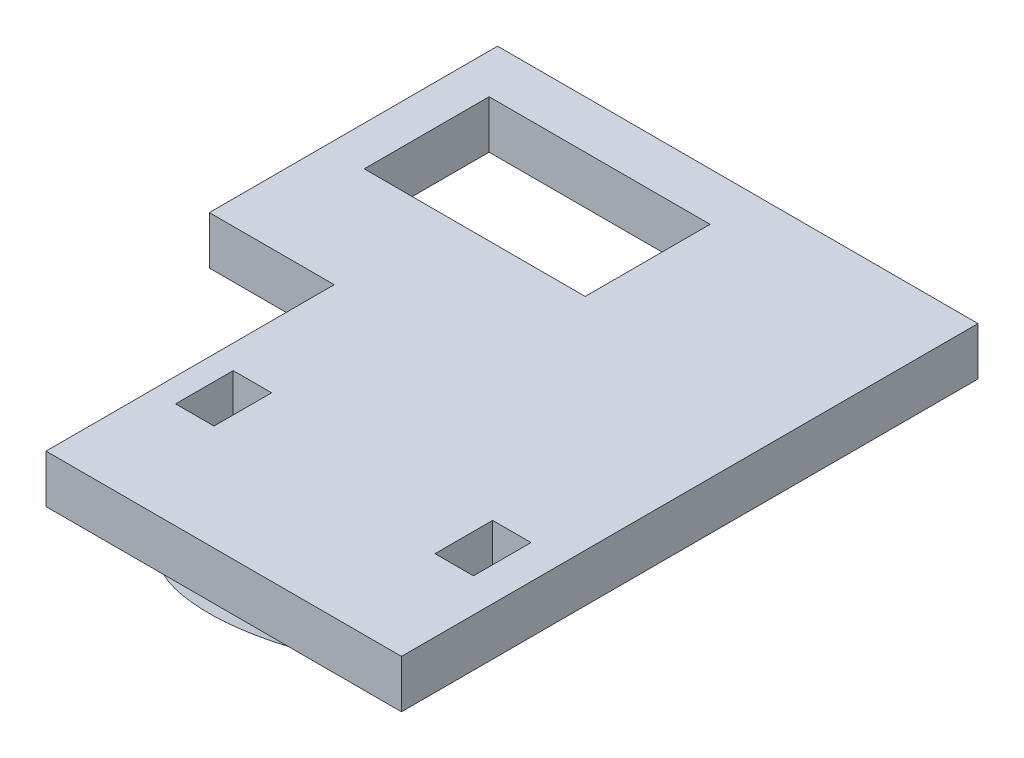
ISO-10303-21;
HEADER;
FILE_DESCRIPTION(('STEP AP214'),'2;1');
FILE_NAME('part.step','',(''),(''),'','','');
FILE_SCHEMA(('AUTOMOTIVE_DESIGN { 1 0 10303 214 1 1 1 1 }'));
ENDSEC;
DATA;
#1=APPLICATION_CONTEXT('core data for automotive mechanical design processes');
#2=APPLICATION_PROTOCOL_DEFINITION('international standard','automotive_design',2000,#1);
#3=PRODUCT_CONTEXT('',#1,'mechanical');
#4=PRODUCT('Part','Part','',(#3));
#5=PRODUCT_RELATED_PRODUCT_CATEGORY('part','',(#4));
#6=PRODUCT_DEFINITION_FORMATION('','',#4);
#7=PRODUCT_DEFINITION_CONTEXT('part definition',#1,'design');
#8=PRODUCT_DEFINITION('design','',#6,#7);
#9=PRODUCT_DEFINITION_SHAPE('','',#8);
#10=(LENGTH_UNIT() NAMED_UNIT(*) SI_UNIT(.MILLI.,.METRE.));
#11=(NAMED_UNIT(*) PLANE_ANGLE_UNIT() SI_UNIT($,.RADIAN.));
#12=(NAMED_UNIT(*) SI_UNIT($,.STERADIAN.) SOLID_ANGLE_UNIT());
#13=UNCERTAINTY_MEASURE_WITH_UNIT(LENGTH_MEASURE(1.E-05),#10,'distance_accuracy_value','');
#14=(GEOMETRIC_REPRESENTATION_CONTEXT(3) GLOBAL_UNCERTAINTY_ASSIGNED_CONTEXT((#13)) GLOBAL_UNIT_ASSIGNED_CONTEXT((#10,
#11,#12)) REPRESENTATION_CONTEXT('',''));
#15=CARTESIAN_POINT('',(0.,0.,0.));
#16=DIRECTION('',(0.,0.,1.));
#17=DIRECTION('',(1.,0.,0.));
#18=AXIS2_PLACEMENT_3D('',#15,#16,#17);
#19=CARTESIAN_POINT('',(0.,0.,0.));
#20=DIRECTION('',(0.,-1.,0.));
#21=DIRECTION('',(0.,0.,-1.));
#22=AXIS2_PLACEMENT_3D('',#19,#20,#21);
#23=PLANE('',#22);
#24=DIRECTION('',(0.,0.,-1.));
#25=VECTOR('',#24,1.);
#26=CARTESIAN_POINT('',(21.4848642681188,0.,13.));
#27=LINE('',#26,#25);
#28=CARTESIAN_POINT('',(21.4848642681188,0.,19.));
#29=VERTEX_POINT('',#28);
#30=CARTESIAN_POINT('',(21.4848642681188,0.,13.));
#31=VERTEX_POINT('',#30);
#32=EDGE_CURVE('E287',#29,#31,#27,.T.);
#33=ORIENTED_EDGE('',*,*,#32,.T.);
#34=DIRECTION('',(-1.,0.,0.));
#35=VECTOR('',#34,1.);
#36=CARTESIAN_POINT('',(17.4848642681188,0.,13.));
#37=LINE('',#36,#35);
#38=CARTESIAN_POINT('',(17.4848642681188,0.,13.));
#39=VERTEX_POINT('',#38);
#40=EDGE_CURVE('E310',#31,#39,#37,.T.);
#41=ORIENTED_EDGE('',*,*,#40,.T.);
#42=DIRECTION('',(0.,0.,1.));
#43=VECTOR('',#42,1.);
#44=CARTESIAN_POINT('',(17.4848642681188,0.,13.));
#45=LINE('',#44,#43);
#46=CARTESIAN_POINT('',(17.4848642681188,0.,19.));
#47=VERTEX_POINT('',#46);
#48=EDGE_CURVE('E279',#39,#47,#45,.T.);
#49=ORIENTED_EDGE('',*,*,#48,.T.);
#50=DIRECTION('',(1.,0.,0.));
#51=VECTOR('',#50,1.);
#52=CARTESIAN_POINT('',(17.4848642681188,0.,19.));
#53=LINE('',#52,#51);
#54=EDGE_CURVE('E283',#47,#29,#53,.T.);
#55=ORIENTED_EDGE('',*,*,#54,.T.);
#56=EDGE_LOOP('',(#33,#41,#49,#55));
#57=FACE_BOUND('',#56,.T.);
#58=DIRECTION('',(0.,0.,-1.));
#59=VECTOR('',#58,1.);
#60=CARTESIAN_POINT('',(2.1161584219283,0.,-25.));
#61=LINE('',#60,#59);
#62=CARTESIAN_POINT('',(2.1161584219283,0.,-12.));
#63=VERTEX_POINT('',#62);
#64=CARTESIAN_POINT('',(2.1161584219283,0.,-25.));
#65=VERTEX_POINT('',#64);
#66=EDGE_CURVE('E323',#63,#65,#61,.T.);
#67=ORIENTED_EDGE('',*,*,#66,.T.);
#68=DIRECTION('',(-1.,0.,0.));
#69=VECTOR('',#68,1.);
#70=CARTESIAN_POINT('',(-20.8838415780717,0.,-25.));
#71=LINE('',#70,#69);
#72=CARTESIAN_POINT('',(-20.8838415780717,0.,-25.));
#73=VERTEX_POINT('',#72);
#74=EDGE_CURVE('E327',#65,#73,#71,.T.);
#75=ORIENTED_EDGE('',*,*,#74,.T.);
#76=DIRECTION('',(0.,0.,1.));
#77=VECTOR('',#76,1.);
#78=CARTESIAN_POINT('',(-20.8838415780717,0.,-25.));
#79=LINE('',#78,#77);
#80=CARTESIAN_POINT('',(-20.8838415780717,0.,-12.));
#81=VERTEX_POINT('',#80);
#82=EDGE_CURVE('E332',#73,#81,#79,.T.);
#83=ORIENTED_EDGE('',*,*,#82,.T.);
#84=DIRECTION('',(1.,0.,0.));
#85=VECTOR('',#84,1.);
#86=CARTESIAN_POINT('',(-20.8838415780717,0.,-12.));
#87=LINE('',#86,#85);
#88=EDGE_CURVE('E336',#81,#63,#87,.T.);
#89=ORIENTED_EDGE('',*,*,#88,.T.);
#90=EDGE_LOOP('',(#67,#75,#83,#89));
#91=FACE_BOUND('',#90,.T.);
#92=DIRECTION('',(0.,0.,1.));
#93=VECTOR('',#92,1.);
#94=CARTESIAN_POINT('',(-12.,0.,0.));
#95=LINE('',#94,#93);
#96=CARTESIAN_POINT('',(-12.,0.,9.68487027661195));
#97=VERTEX_POINT('',#96);
#98=CARTESIAN_POINT('',(-12.,0.,30.));
#99=VERTEX_POINT('',#98);
#100=EDGE_CURVE('E244',#97,#99,#95,.T.);
#101=ORIENTED_EDGE('',*,*,#100,.F.);
#102=CARTESIAN_POINT('',(-11.9999999869951,0.,9.68487027661134));
#103=CARTESIAN_POINT('',(-11.9999879460501,0.,9.85246758281188));
#104=CARTESIAN_POINT('',(-11.9964211662955,0.,10.0200414324728));
#105=CARTESIAN_POINT('',(-11.9822535776862,0.,10.3548894634409));
#106=CARTESIAN_POINT('',(-11.9716528740302,0.,10.5221636491922));
#107=CARTESIAN_POINT('',(-11.9294205604047,0.,11.0230740749682));
#108=CARTESIAN_POINT('',(-11.8873586579816,0.,11.3558898182705));
#109=CARTESIAN_POINT('',(-11.7771767908481,0.,12.0081488487328));
#110=CARTESIAN_POINT('',(-11.7097704681746,0.,12.3277137397941));
#111=CARTESIAN_POINT('',(-11.5488235316981,0.,12.9601915911763));
#112=CARTESIAN_POINT('',(-11.455284178913,0.,13.2731048716789));
#113=CARTESIAN_POINT('',(-11.2451700137892,0.,13.8844946256083));
#114=CARTESIAN_POINT('',(-11.1290623702342,0.,14.1831320192302));
#115=CARTESIAN_POINT('',(-10.8734645594487,0.,14.7702331871478));
#116=CARTESIAN_POINT('',(-10.7339740676675,0.,15.0586968201658));
#117=CARTESIAN_POINT('',(-10.4281380051154,0.,15.6309371729727));
#118=CARTESIAN_POINT('',(-10.2611790926551,0.,15.9143874860475));
#119=CARTESIAN_POINT('',(-9.99383703685191,0.,16.3285694872892));
#120=CARTESIAN_POINT('',(-9.90188936380248,0.,16.4648192312281));
#121=CARTESIAN_POINT('',(-9.71250309071285,0.,16.733440375574));
#122=CARTESIAN_POINT('',(-9.61506468364963,0.,16.865811912036));
#123=CARTESIAN_POINT('',(-9.51494648048746,0.,16.9961509217686));
#124=B_SPLINE_CURVE_WITH_KNOTS('',3,(#102,#103,#104,#105,#106,#107,#108,#109,#110,#111,#112,
#113,#114,#115,#116,#117,#118,#119,#120,#121,#122,#123),.UNSPECIFIED.,.F.,.F.,(4,2,2,2,2,2,2,2,
2,2,4),(0.,0.502709515741837,1.00541151318033,2.01054146695505,2.989264193479,3.96793970106355,
4.92817772320738,5.8884290744299,6.87410929174356,7.36711021606487,7.86009382420233),.UNSPECIFIED.);
#125=CARTESIAN_POINT('',(-9.51504110383621,0.,16.9962236076011));
#126=VERTEX_POINT('',#125);
#127=EDGE_CURVE('E12',#97,#126,#124,.T.);
#128=ORIENTED_EDGE('',*,*,#127,.T.);
#129=DIRECTION('',(0.,0.,1.));
#130=VECTOR('',#129,1.);
#131=CARTESIAN_POINT('',(-9.5151357318812,0.,13.));
#132=LINE('',#131,#130);
#133=CARTESIAN_POINT('',(-9.5151357318812,0.,19.));
#134=VERTEX_POINT('',#133);
#135=EDGE_CURVE('E235',#126,#134,#132,.T.);
#136=ORIENTED_EDGE('',*,*,#135,.T.);
#137=DIRECTION('',(1.,0.,0.));
#138=VECTOR('',#137,1.);
#139=CARTESIAN_POINT('',(-9.5151357318812,0.,19.));
#140=LINE('',#139,#138);
#141=CARTESIAN_POINT('',(-7.56442455995392,0.,18.9999341993934));
#142=VERTEX_POINT('',#141);
#143=EDGE_CURVE('E228',#134,#142,#140,.T.);
#144=ORIENTED_EDGE('',*,*,#143,.T.);
#145=CARTESIAN_POINT('',(0.,0.,-2.31568428032765));
#146=CARTESIAN_POINT('',(0.5,0.,-2.31568428032765));
#147=CARTESIAN_POINT('',(1.03156081133997,0.,-2.28467167166605));
#148=CARTESIAN_POINT('',(2.15427989662464,0.,-2.13430750845828));
#149=CARTESIAN_POINT('',(2.7456,0.,-2.01488428032765));
#150=CARTESIAN_POINT('',(3.9744,0.,-1.65648428032765));
#151=CARTESIAN_POINT('',(4.61204393384674,0.,-1.41731286257737));
#152=CARTESIAN_POINT('',(5.90480999873753,0.,-0.787089405943102));
#153=CARTESIAN_POINT('',(6.56,0.,-0.395684280327651));
#154=CARTESIAN_POINT('',(7.84,0.,0.564315719672349));
#155=CARTESIAN_POINT('',(8.46462750985176,0.,1.13336807471082));
#156=CARTESIAN_POINT('',(9.61756427097016,0.,2.45444144682566));
#157=CARTESIAN_POINT('',(10.1453287197232,0.,3.20680706915332));
#158=CARTESIAN_POINT('',(11.0311418685121,0.,4.86770672313255));
#159=CARTESIAN_POINT('',(11.3884023668639,0.,5.77615003919898));
#160=CARTESIAN_POINT('',(11.8731360946746,0.,7.68478909245342));
#161=CARTESIAN_POINT('',(12.,0.,8.68431571967235));
#162=CARTESIAN_POINT('',(12.,0.,10.6843157196723));
#163=CARTESIAN_POINT('',(11.8731360946746,0.,11.6838423468913));
#164=CARTESIAN_POINT('',(11.3884023668639,0.,13.5924814001457));
#165=CARTESIAN_POINT('',(11.0311418685121,0.,14.5009247162121));
#166=CARTESIAN_POINT('',(10.1453287197232,0.,16.1618243701914));
#167=CARTESIAN_POINT('',(9.61756427097016,0.,16.914189992519));
#168=CARTESIAN_POINT('',(8.46462750985175,0.,18.2352633646339));
#169=CARTESIAN_POINT('',(7.84,0.,18.8043157196724));
#170=CARTESIAN_POINT('',(6.56,0.,19.7643157196724));
#171=CARTESIAN_POINT('',(5.90480999873753,0.,20.1557208452878));
#172=CARTESIAN_POINT('',(4.61204393384673,0.,20.7859443019221));
#173=CARTESIAN_POINT('',(3.9744,0.,21.0251157196724));
#174=CARTESIAN_POINT('',(2.7456,0.,21.3835157196724));
#175=CARTESIAN_POINT('',(2.15427989662464,0.,21.502938947803));
#176=CARTESIAN_POINT('',(1.03156081133996,0.,21.6533031110107));
#177=CARTESIAN_POINT('',(0.5,0.,21.6843157196724));
#178=CARTESIAN_POINT('',(-0.499999999999999,0.,21.6843157196723));
#179=CARTESIAN_POINT('',(-1.03156081133996,0.,21.6533031110107));
#180=CARTESIAN_POINT('',(-2.15427989662464,0.,21.502938947803));
#181=CARTESIAN_POINT('',(-2.7456,0.,21.3835157196724));
#182=CARTESIAN_POINT('',(-3.9744,0.,21.0251157196723));
#183=CARTESIAN_POINT('',(-4.61204393384673,0.,20.7859443019221));
#184=CARTESIAN_POINT('',(-5.90480999873753,0.,20.1557208452878));
#185=CARTESIAN_POINT('',(-6.56,0.,19.7643157196724));
#186=CARTESIAN_POINT('',(-7.84,0.,18.8043157196723));
#187=CARTESIAN_POINT('',(-8.46462750985175,0.,18.2352633646339));
#188=CARTESIAN_POINT('',(-9.61756427097016,0.,16.914189992519));
#189=CARTESIAN_POINT('',(-10.1453287197232,0.,16.1618243701914));
#190=CARTESIAN_POINT('',(-11.0311418685121,0.,14.5009247162121));
#191=CARTESIAN_POINT('',(-11.3884023668639,0.,13.5924814001457));
#192=CARTESIAN_POINT('',(-11.8731360946746,0.,11.6838423468913));
#193=CARTESIAN_POINT('',(-12.,0.,10.6843157196723));
#194=CARTESIAN_POINT('',(-12.,0.,8.68431571967235));
#195=CARTESIAN_POINT('',(-11.8731360946746,0.,7.68478909245341));
#196=CARTESIAN_POINT('',(-11.3884023668639,0.,5.77615003919898));
#197=CARTESIAN_POINT('',(-11.0311418685121,0.,4.86770672313256));
#198=CARTESIAN_POINT('',(-10.1453287197232,0.,3.20680706915332));
#199=CARTESIAN_POINT('',(-9.61756427097016,0.,2.45444144682566));
#200=CARTESIAN_POINT('',(-8.46462750985175,0.,1.13336807471082));
#201=CARTESIAN_POINT('',(-7.84,0.,0.56431571967235));
#202=CARTESIAN_POINT('',(-6.56,0.,-0.39568428032765));
#203=CARTESIAN_POINT('',(-5.90480999873753,0.,-0.787089405943102));
#204=CARTESIAN_POINT('',(-4.61204393384673,0.,-1.41731286257737));
#205=CARTESIAN_POINT('',(-3.9744,0.,-1.65648428032765));
#206=CARTESIAN_POINT('',(-2.7456,0.,-2.01488428032765));
#207=CARTESIAN_POINT('',(-2.15427989662464,0.,-2.13430750845828));
#208=CARTESIAN_POINT('',(-1.03156081133996,0.,-2.28467167166605));
#209=CARTESIAN_POINT('',(-0.5,0.,-2.31568428032765));
#210=CARTESIAN_POINT('',(0.,0.,-2.31568428032765));
#211=B_SPLINE_CURVE_WITH_KNOTS('',3,(#145,#146,#147,#148,#149,#150,#151,#152,#153,#154,#155,
#156,#157,#158,#159,#160,#161,#162,#163,#164,#165,#166,#167,#168,#169,#170,#171,#172,#173,#174,
#175,#176,#177,#178,#179,#180,#181,#182,#183,#184,#185,#186,#187,#188,#189,#190,#191,#192,#193,
#194,#195,#196,#197,#198,#199,#200,#201,#202,#203,#204,#205,#206,#207,#208,#209,#210),
.UNSPECIFIED.,.T.,.F.,(4,2,2,2,2,2,2,2,2,2,2,2,2,2,2,2,2,2,2,2,2,2,2,2,2,2,2,2,2,2,2,2,4),(0.,
0.03125,0.0625,0.09375,0.125,0.15625,0.1875,0.21875,0.25,0.28125,0.3125,0.34375,0.375,0.40625,
0.4375,0.46875,0.5,0.53125,0.5625,0.59375,0.625,0.65625,0.6875,0.71875,0.75,0.78125,0.8125,
0.84375,0.875,0.90625,0.9375,0.96875,1.),.UNSPECIFIED.);
#212=EDGE_CURVE('E71',#142,#97,#211,.F.);
#213=ORIENTED_EDGE('',*,*,#212,.T.);
#214=CARTESIAN_POINT('',(-12.,0.,0.));
#215=VERTEX_POINT('',#214);
#216=EDGE_CURVE('E403',#215,#97,#95,.T.);
#217=ORIENTED_EDGE('',*,*,#216,.F.);
#218=DIRECTION('',(1.,0.,0.));
#219=VECTOR('',#218,1.);
#220=CARTESIAN_POINT('',(-12.,0.,0.));
#221=LINE('',#220,#219);
#222=CARTESIAN_POINT('',(-25.,0.,0.));
#223=VERTEX_POINT('',#222);
#224=EDGE_CURVE('E397',#223,#215,#221,.T.);
#225=ORIENTED_EDGE('',*,*,#224,.F.);
#226=DIRECTION('',(0.,0.,1.));
#227=VECTOR('',#226,1.);
#228=CARTESIAN_POINT('',(-25.,0.,0.));
#229=LINE('',#228,#227);
#230=CARTESIAN_POINT('',(-25.,0.,-30.));
#231=VERTEX_POINT('',#230);
#232=EDGE_CURVE('E394',#231,#223,#229,.T.);
#233=ORIENTED_EDGE('',*,*,#232,.F.);
#234=DIRECTION('',(-1.,0.,0.));
#235=VECTOR('',#234,1.);
#236=CARTESIAN_POINT('',(-25.,0.,-30.));
#237=LINE('',#236,#235);
#238=CARTESIAN_POINT('',(25.,0.,-30.));
#239=VERTEX_POINT('',#238);
#240=EDGE_CURVE('E391',#239,#231,#237,.T.);
#241=ORIENTED_EDGE('',*,*,#240,.F.);
#242=DIRECTION('',(0.,0.,-1.));
#243=VECTOR('',#242,1.);
#244=CARTESIAN_POINT('',(25.,0.,30.));
#245=LINE('',#244,#243);
#246=CARTESIAN_POINT('',(25.,0.,30.));
#247=VERTEX_POINT('',#246);
#248=EDGE_CURVE('E357',#247,#239,#245,.T.);
#249=ORIENTED_EDGE('',*,*,#248,.F.);
#250=DIRECTION('',(1.,0.,0.));
#251=VECTOR('',#250,1.);
#252=CARTESIAN_POINT('',(0.,0.,30.));
#253=LINE('',#252,#251);
#254=EDGE_CURVE('E372',#99,#247,#253,.T.);
#255=ORIENTED_EDGE('',*,*,#254,.F.);
#256=EDGE_LOOP('',(#101,#128,#136,#144,#213,#217,#225,#233,#241,#249,#255));
#257=FACE_BOUND('',#256,.T.);
#258=ADVANCED_FACE('F55',(#57,#91,#257),#23,.T.);
#259=CARTESIAN_POINT('',(25.,5.,30.));
#260=DIRECTION('',(-1.,0.,0.));
#261=DIRECTION('',(0.,0.,1.));
#262=AXIS2_PLACEMENT_3D('',#259,#260,#261);
#263=PLANE('',#262);
#264=ORIENTED_EDGE('',*,*,#248,.T.);
#265=DIRECTION('',(0.,-1.,0.));
#266=VECTOR('',#265,1.);
#267=CARTESIAN_POINT('',(25.,5.,-30.));
#268=LINE('',#267,#266);
#269=CARTESIAN_POINT('',(25.,5.,-30.));
#270=VERTEX_POINT('',#269);
#271=EDGE_CURVE('E206',#270,#239,#268,.T.);
#272=ORIENTED_EDGE('',*,*,#271,.F.);
#273=DIRECTION('',(0.,0.,-1.));
#274=VECTOR('',#273,1.);
#275=CARTESIAN_POINT('',(25.,5.,30.));
#276=LINE('',#275,#274);
#277=CARTESIAN_POINT('',(25.,5.,30.));
#278=VERTEX_POINT('',#277);
#279=EDGE_CURVE('E367',#278,#270,#276,.T.);
#280=ORIENTED_EDGE('',*,*,#279,.F.);
#281=DIRECTION('',(0.,-1.,0.));
#282=VECTOR('',#281,1.);
#283=CARTESIAN_POINT('',(25.,5.,30.));
#284=LINE('',#283,#282);
#285=EDGE_CURVE('E387',#278,#247,#284,.T.);
#286=ORIENTED_EDGE('',*,*,#285,.T.);
#287=EDGE_LOOP('',(#264,#272,#280,#286));
#288=FACE_BOUND('',#287,.T.);
#289=ADVANCED_FACE('F57',(#288),#263,.F.);
#290=CARTESIAN_POINT('',(-25.,5.,-30.));
#291=DIRECTION('',(0.,0.,1.));
#292=DIRECTION('',(1.,0.,0.));
#293=AXIS2_PLACEMENT_3D('',#290,#291,#292);
#294=PLANE('',#293);
#295=ORIENTED_EDGE('',*,*,#240,.T.);
#296=DIRECTION('',(0.,-1.,0.));
#297=VECTOR('',#296,1.);
#298=CARTESIAN_POINT('',(-25.,5.,-30.));
#299=LINE('',#298,#297);
#300=CARTESIAN_POINT('',(-25.,5.,-30.));
#301=VERTEX_POINT('',#300);
#302=EDGE_CURVE('E448',#301,#231,#299,.T.);
#303=ORIENTED_EDGE('',*,*,#302,.F.);
#304=DIRECTION('',(-1.,0.,0.));
#305=VECTOR('',#304,1.);
#306=CARTESIAN_POINT('',(-25.,5.,-30.));
#307=LINE('',#306,#305);
#308=EDGE_CURVE('E371',#270,#301,#307,.T.);
#309=ORIENTED_EDGE('',*,*,#308,.F.);
#310=ORIENTED_EDGE('',*,*,#271,.T.);
#311=EDGE_LOOP('',(#295,#303,#309,#310));
#312=FACE_BOUND('',#311,.T.);
#313=ADVANCED_FACE('F437',(#312),#294,.F.);
#314=CARTESIAN_POINT('',(-25.,5.,0.));
#315=DIRECTION('',(1.,0.,0.));
#316=DIRECTION('',(0.,0.,-1.));
#317=AXIS2_PLACEMENT_3D('',#314,#315,#316);
#318=PLANE('',#317);
#319=ORIENTED_EDGE('',*,*,#232,.T.);
#320=DIRECTION('',(0.,-1.,0.));
#321=VECTOR('',#320,1.);
#322=CARTESIAN_POINT('',(-25.,5.,0.));
#323=LINE('',#322,#321);
#324=CARTESIAN_POINT('',(-25.,5.,0.));
#325=VERTEX_POINT('',#324);
#326=EDGE_CURVE('E456',#325,#223,#323,.T.);
#327=ORIENTED_EDGE('',*,*,#326,.F.);
#328=DIRECTION('',(0.,0.,1.));
#329=VECTOR('',#328,1.);
#330=CARTESIAN_POINT('',(-25.,5.,0.));
#331=LINE('',#330,#329);
#332=EDGE_CURVE('E375',#301,#325,#331,.T.);
#333=ORIENTED_EDGE('',*,*,#332,.F.);
#334=ORIENTED_EDGE('',*,*,#302,.T.);
#335=EDGE_LOOP('',(#319,#327,#333,#334));
#336=FACE_BOUND('',#335,.T.);
#337=ADVANCED_FACE('F434',(#336),#318,.F.);
#338=CARTESIAN_POINT('',(-12.,5.,0.));
#339=DIRECTION('',(0.,0.,-1.));
#340=DIRECTION('',(-1.,0.,0.));
#341=AXIS2_PLACEMENT_3D('',#338,#339,#340);
#342=PLANE('',#341);
#343=ORIENTED_EDGE('',*,*,#224,.T.);
#344=DIRECTION('',(0.,-1.,0.));
#345=VECTOR('',#344,1.);
#346=CARTESIAN_POINT('',(-12.,5.,0.));
#347=LINE('',#346,#345);
#348=CARTESIAN_POINT('',(-12.,5.,0.));
#349=VERTEX_POINT('',#348);
#350=EDGE_CURVE('E462',#349,#215,#347,.T.);
#351=ORIENTED_EDGE('',*,*,#350,.F.);
#352=DIRECTION('',(1.,0.,0.));
#353=VECTOR('',#352,1.);
#354=CARTESIAN_POINT('',(-12.,5.,0.));
#355=LINE('',#354,#353);
#356=EDGE_CURVE('E378',#325,#349,#355,.T.);
#357=ORIENTED_EDGE('',*,*,#356,.F.);
#358=ORIENTED_EDGE('',*,*,#326,.T.);
#359=EDGE_LOOP('',(#343,#351,#357,#358));
#360=FACE_BOUND('',#359,.T.);
#361=ADVANCED_FACE('F430',(#360),#342,.F.);
#362=CARTESIAN_POINT('',(-12.,5.,0.));
#363=DIRECTION('',(1.,0.,0.));
#364=DIRECTION('',(0.,0.,-1.));
#365=AXIS2_PLACEMENT_3D('',#362,#363,#364);
#366=PLANE('',#365);
#367=ORIENTED_EDGE('',*,*,#216,.T.);
#368=ORIENTED_EDGE('',*,*,#100,.T.);
#369=DIRECTION('',(0.,-1.,0.));
#370=VECTOR('',#369,1.);
#371=CARTESIAN_POINT('',(-12.,5.,30.));
#372=LINE('',#371,#370);
#373=CARTESIAN_POINT('',(-12.,5.,30.));
#374=VERTEX_POINT('',#373);
#375=EDGE_CURVE('E466',#374,#99,#372,.T.);
#376=ORIENTED_EDGE('',*,*,#375,.F.);
#377=DIRECTION('',(0.,0.,1.));
#378=VECTOR('',#377,1.);
#379=CARTESIAN_POINT('',(-12.,5.,0.));
#380=LINE('',#379,#378);
#381=EDGE_CURVE('E381',#349,#374,#380,.T.);
#382=ORIENTED_EDGE('',*,*,#381,.F.);
#383=ORIENTED_EDGE('',*,*,#350,.T.);
#384=EDGE_LOOP('',(#367,#368,#376,#382,#383));
#385=FACE_BOUND('',#384,.T.);
#386=ADVANCED_FACE('F426',(#385),#366,.F.);
#387=CARTESIAN_POINT('',(0.,5.,30.));
#388=DIRECTION('',(0.,0.,-1.));
#389=DIRECTION('',(-1.,0.,0.));
#390=AXIS2_PLACEMENT_3D('',#387,#388,#389);
#391=PLANE('',#390);
#392=ORIENTED_EDGE('',*,*,#254,.T.);
#393=ORIENTED_EDGE('',*,*,#285,.F.);
#394=DIRECTION('',(1.,0.,0.));
#395=VECTOR('',#394,1.);
#396=CARTESIAN_POINT('',(-12.,5.,30.));
#397=LINE('',#396,#395);
#398=EDGE_CURVE('E384',#374,#278,#397,.T.);
#399=ORIENTED_EDGE('',*,*,#398,.F.);
#400=ORIENTED_EDGE('',*,*,#375,.T.);
#401=EDGE_LOOP('',(#392,#393,#399,#400));
#402=FACE_BOUND('',#401,.T.);
#403=ADVANCED_FACE('F422',(#402),#391,.F.);
#404=CARTESIAN_POINT('',(0.,5.,0.));
#405=DIRECTION('',(0.,-1.,0.));
#406=DIRECTION('',(0.,0.,-1.));
#407=AXIS2_PLACEMENT_3D('',#404,#405,#406);
#408=PLANE('',#407);
#409=DIRECTION('',(-1.,0.,0.));
#410=VECTOR('',#409,1.);
#411=CARTESIAN_POINT('',(-9.5151357318812,5.,13.));
#412=LINE('',#411,#410);
#413=CARTESIAN_POINT('',(-5.5151357318812,5.,13.));
#414=VERTEX_POINT('',#413);
#415=CARTESIAN_POINT('',(-9.5151357318812,5.,13.));
#416=VERTEX_POINT('',#415);
#417=EDGE_CURVE('E253',#414,#416,#412,.T.);
#418=ORIENTED_EDGE('',*,*,#417,.F.);
#419=DIRECTION('',(0.,0.,-1.));
#420=VECTOR('',#419,1.);
#421=CARTESIAN_POINT('',(-5.5151357318812,5.,13.));
#422=LINE('',#421,#420);
#423=CARTESIAN_POINT('',(-5.5151357318812,5.,19.));
#424=VERTEX_POINT('',#423);
#425=EDGE_CURVE('E84',#424,#414,#422,.T.);
#426=ORIENTED_EDGE('',*,*,#425,.F.);
#427=DIRECTION('',(1.,0.,0.));
#428=VECTOR('',#427,1.);
#429=CARTESIAN_POINT('',(-9.5151357318812,5.,19.));
#430=LINE('',#429,#428);
#431=CARTESIAN_POINT('',(-9.5151357318812,5.,19.));
#432=VERTEX_POINT('',#431);
#433=EDGE_CURVE('E261',#432,#424,#430,.T.);
#434=ORIENTED_EDGE('',*,*,#433,.F.);
#435=DIRECTION('',(0.,0.,1.));
#436=VECTOR('',#435,1.);
#437=CARTESIAN_POINT('',(-9.5151357318812,5.,13.));
#438=LINE('',#437,#436);
#439=EDGE_CURVE('E257',#416,#432,#438,.T.);
#440=ORIENTED_EDGE('',*,*,#439,.F.);
#441=EDGE_LOOP('',(#418,#426,#434,#440));
#442=FACE_BOUND('',#441,.T.);
#443=DIRECTION('',(-1.,0.,0.));
#444=VECTOR('',#443,1.);
#445=CARTESIAN_POINT('',(17.4848642681188,5.,13.));
#446=LINE('',#445,#444);
#447=CARTESIAN_POINT('',(21.4848642681188,5.,13.));
#448=VERTEX_POINT('',#447);
#449=CARTESIAN_POINT('',(17.4848642681188,5.,13.));
#450=VERTEX_POINT('',#449);
#451=EDGE_CURVE('E294',#448,#450,#446,.T.);
#452=ORIENTED_EDGE('',*,*,#451,.F.);
#453=DIRECTION('',(0.,0.,-1.));
#454=VECTOR('',#453,1.);
#455=CARTESIAN_POINT('',(21.4848642681188,5.,13.));
#456=LINE('',#455,#454);
#457=CARTESIAN_POINT('',(21.4848642681188,5.,19.));
#458=VERTEX_POINT('',#457);
#459=EDGE_CURVE('E291',#458,#448,#456,.T.);
#460=ORIENTED_EDGE('',*,*,#459,.F.);
#461=DIRECTION('',(1.,0.,0.));
#462=VECTOR('',#461,1.);
#463=CARTESIAN_POINT('',(17.4848642681188,5.,19.));
#464=LINE('',#463,#462);
#465=CARTESIAN_POINT('',(17.4848642681188,5.,19.));
#466=VERTEX_POINT('',#465);
#467=EDGE_CURVE('E302',#466,#458,#464,.T.);
#468=ORIENTED_EDGE('',*,*,#467,.F.);
#469=DIRECTION('',(0.,0.,1.));
#470=VECTOR('',#469,1.);
#471=CARTESIAN_POINT('',(17.4848642681188,5.,13.));
#472=LINE('',#471,#470);
#473=EDGE_CURVE('E298',#450,#466,#472,.T.);
#474=ORIENTED_EDGE('',*,*,#473,.F.);
#475=EDGE_LOOP('',(#452,#460,#468,#474));
#476=FACE_BOUND('',#475,.T.);
#477=DIRECTION('',(-1.,0.,0.));
#478=VECTOR('',#477,1.);
#479=CARTESIAN_POINT('',(-20.8838415780717,5.,-25.));
#480=LINE('',#479,#478);
#481=CARTESIAN_POINT('',(2.1161584219283,5.,-25.));
#482=VERTEX_POINT('',#481);
#483=CARTESIAN_POINT('',(-20.8838415780717,5.,-25.));
#484=VERTEX_POINT('',#483);
#485=EDGE_CURVE('E343',#482,#484,#480,.T.);
#486=ORIENTED_EDGE('',*,*,#485,.F.);
#487=DIRECTION('',(0.,0.,-1.));
#488=VECTOR('',#487,1.);
#489=CARTESIAN_POINT('',(2.1161584219283,5.,-25.));
#490=LINE('',#489,#488);
#491=CARTESIAN_POINT('',(2.1161584219283,5.,-12.));
#492=VERTEX_POINT('',#491);
#493=EDGE_CURVE('E278',#492,#482,#490,.T.);
#494=ORIENTED_EDGE('',*,*,#493,.F.);
#495=DIRECTION('',(1.,0.,0.));
#496=VECTOR('',#495,1.);
#497=CARTESIAN_POINT('',(-20.8838415780717,5.,-12.));
#498=LINE('',#497,#496);
#499=CARTESIAN_POINT('',(-20.8838415780717,5.,-12.));
#500=VERTEX_POINT('',#499);
#501=EDGE_CURVE('E328',#500,#492,#498,.T.);
#502=ORIENTED_EDGE('',*,*,#501,.F.);
#503=DIRECTION('',(0.,0.,1.));
#504=VECTOR('',#503,1.);
#505=CARTESIAN_POINT('',(-20.8838415780717,5.,-25.));
#506=LINE('',#505,#504);
#507=EDGE_CURVE('E347',#484,#500,#506,.T.);
#508=ORIENTED_EDGE('',*,*,#507,.F.);
#509=EDGE_LOOP('',(#486,#494,#502,#508));
#510=FACE_BOUND('',#509,.T.);
#511=ORIENTED_EDGE('',*,*,#279,.T.);
#512=ORIENTED_EDGE('',*,*,#308,.T.);
#513=ORIENTED_EDGE('',*,*,#332,.T.);
#514=ORIENTED_EDGE('',*,*,#356,.T.);
#515=ORIENTED_EDGE('',*,*,#381,.T.);
#516=ORIENTED_EDGE('',*,*,#398,.T.);
#517=EDGE_LOOP('',(#511,#512,#513,#514,#515,#516));
#518=FACE_BOUND('',#517,.T.);
#519=ADVANCED_FACE('F420',(#442,#476,#510,#518),#408,.F.);
#520=CARTESIAN_POINT('',(2.1161584219283,0.,-25.));
#521=DIRECTION('',(1.,0.,0.));
#522=DIRECTION('',(0.,0.,-1.));
#523=AXIS2_PLACEMENT_3D('',#520,#521,#522);
#524=PLANE('',#523);
#525=ORIENTED_EDGE('',*,*,#493,.T.);
#526=DIRECTION('',(0.,1.,0.));
#527=VECTOR('',#526,1.);
#528=CARTESIAN_POINT('',(2.1161584219283,0.,-25.));
#529=LINE('',#528,#527);
#530=EDGE_CURVE('E340',#65,#482,#529,.T.);
#531=ORIENTED_EDGE('',*,*,#530,.F.);
#532=ORIENTED_EDGE('',*,*,#66,.F.);
#533=DIRECTION('',(0.,1.,0.));
#534=VECTOR('',#533,1.);
#535=CARTESIAN_POINT('',(2.1161584219283,0.,-12.));
#536=LINE('',#535,#534);
#537=EDGE_CURVE('E354',#63,#492,#536,.T.);
#538=ORIENTED_EDGE('',*,*,#537,.T.);
#539=EDGE_LOOP('',(#525,#531,#532,#538));
#540=FACE_BOUND('',#539,.T.);
#541=ADVANCED_FACE('F578',(#540),#524,.F.);
#542=CARTESIAN_POINT('',(-20.8838415780717,0.,-12.));
#543=DIRECTION('',(0.,0.,1.));
#544=DIRECTION('',(1.,0.,0.));
#545=AXIS2_PLACEMENT_3D('',#542,#543,#544);
#546=PLANE('',#545);
#547=ORIENTED_EDGE('',*,*,#501,.T.);
#548=ORIENTED_EDGE('',*,*,#537,.F.);
#549=ORIENTED_EDGE('',*,*,#88,.F.);
#550=DIRECTION('',(0.,1.,0.));
#551=VECTOR('',#550,1.);
#552=CARTESIAN_POINT('',(-20.8838415780717,0.,-12.));
#553=LINE('',#552,#551);
#554=EDGE_CURVE('E358',#81,#500,#553,.T.);
#555=ORIENTED_EDGE('',*,*,#554,.T.);
#556=EDGE_LOOP('',(#547,#548,#549,#555));
#557=FACE_BOUND('',#556,.T.);
#558=ADVANCED_FACE('F574',(#557),#546,.F.);
#559=CARTESIAN_POINT('',(-20.8838415780717,0.,-25.));
#560=DIRECTION('',(-1.,0.,0.));
#561=DIRECTION('',(0.,0.,1.));
#562=AXIS2_PLACEMENT_3D('',#559,#560,#561);
#563=PLANE('',#562);
#564=ORIENTED_EDGE('',*,*,#507,.T.);
#565=ORIENTED_EDGE('',*,*,#554,.F.);
#566=ORIENTED_EDGE('',*,*,#82,.F.);
#567=DIRECTION('',(0.,1.,0.));
#568=VECTOR('',#567,1.);
#569=CARTESIAN_POINT('',(-20.8838415780717,0.,-25.));
#570=LINE('',#569,#568);
#571=EDGE_CURVE('E361',#73,#484,#570,.T.);
#572=ORIENTED_EDGE('',*,*,#571,.T.);
#573=EDGE_LOOP('',(#564,#565,#566,#572));
#574=FACE_BOUND('',#573,.T.);
#575=ADVANCED_FACE('F577',(#574),#563,.F.);
#576=CARTESIAN_POINT('',(-20.8838415780717,0.,-25.));
#577=DIRECTION('',(0.,0.,-1.));
#578=DIRECTION('',(-1.,0.,0.));
#579=AXIS2_PLACEMENT_3D('',#576,#577,#578);
#580=PLANE('',#579);
#581=ORIENTED_EDGE('',*,*,#485,.T.);
#582=ORIENTED_EDGE('',*,*,#571,.F.);
#583=ORIENTED_EDGE('',*,*,#74,.F.);
#584=ORIENTED_EDGE('',*,*,#530,.T.);
#585=EDGE_LOOP('',(#581,#582,#583,#584));
#586=FACE_BOUND('',#585,.T.);
#587=ADVANCED_FACE('F572',(#586),#580,.F.);
#588=CARTESIAN_POINT('',(21.4848642681188,-0.00100000000000013,13.));
#589=DIRECTION('',(1.,0.,0.));
#590=DIRECTION('',(0.,0.,-1.));
#591=AXIS2_PLACEMENT_3D('',#588,#589,#590);
#592=PLANE('',#591);
#593=DIRECTION('',(0.,1.,0.));
#594=VECTOR('',#593,1.);
#595=CARTESIAN_POINT('',(21.4848642681188,-0.00100000000000013,19.));
#596=LINE('',#595,#594);
#597=EDGE_CURVE('E307',#29,#458,#596,.T.);
#598=ORIENTED_EDGE('',*,*,#597,.T.);
#599=ORIENTED_EDGE('',*,*,#459,.T.);
#600=DIRECTION('',(0.,1.,0.));
#601=VECTOR('',#600,1.);
#602=CARTESIAN_POINT('',(21.4848642681188,-0.00100000000000013,13.));
#603=LINE('',#602,#601);
#604=EDGE_CURVE('E306',#31,#448,#603,.T.);
#605=ORIENTED_EDGE('',*,*,#604,.F.);
#606=ORIENTED_EDGE('',*,*,#32,.F.);
#607=EDGE_LOOP('',(#598,#599,#605,#606));
#608=FACE_BOUND('',#607,.T.);
#609=ADVANCED_FACE('F562',(#608),#592,.F.);
#610=CARTESIAN_POINT('',(17.4848642681188,-0.00100000000000013,19.));
#611=DIRECTION('',(0.,0.,1.));
#612=DIRECTION('',(1.,0.,0.));
#613=AXIS2_PLACEMENT_3D('',#610,#611,#612);
#614=PLANE('',#613);
#615=DIRECTION('',(0.,1.,0.));
#616=VECTOR('',#615,1.);
#617=CARTESIAN_POINT('',(17.4848642681188,-0.00100000000000013,19.));
#618=LINE('',#617,#616);
#619=EDGE_CURVE('E311',#47,#466,#618,.T.);
#620=ORIENTED_EDGE('',*,*,#619,.T.);
#621=ORIENTED_EDGE('',*,*,#467,.T.);
#622=ORIENTED_EDGE('',*,*,#597,.F.);
#623=ORIENTED_EDGE('',*,*,#54,.F.);
#624=EDGE_LOOP('',(#620,#621,#622,#623));
#625=FACE_BOUND('',#624,.T.);
#626=ADVANCED_FACE('F558',(#625),#614,.F.);
#627=CARTESIAN_POINT('',(17.4848642681188,-0.00100000000000013,13.));
#628=DIRECTION('',(-1.,0.,0.));
#629=DIRECTION('',(0.,0.,1.));
#630=AXIS2_PLACEMENT_3D('',#627,#628,#629);
#631=PLANE('',#630);
#632=DIRECTION('',(0.,1.,0.));
#633=VECTOR('',#632,1.);
#634=CARTESIAN_POINT('',(17.4848642681188,-0.00100000000000013,13.));
#635=LINE('',#634,#633);
#636=EDGE_CURVE('E314',#39,#450,#635,.T.);
#637=ORIENTED_EDGE('',*,*,#636,.T.);
#638=ORIENTED_EDGE('',*,*,#473,.T.);
#639=ORIENTED_EDGE('',*,*,#619,.F.);
#640=ORIENTED_EDGE('',*,*,#48,.F.);
#641=EDGE_LOOP('',(#637,#638,#639,#640));
#642=FACE_BOUND('',#641,.T.);
#643=ADVANCED_FACE('F561',(#642),#631,.F.);
#644=CARTESIAN_POINT('',(17.4848642681188,-0.00100000000000013,13.));
#645=DIRECTION('',(0.,0.,-1.));
#646=DIRECTION('',(-1.,0.,0.));
#647=AXIS2_PLACEMENT_3D('',#644,#645,#646);
#648=PLANE('',#647);
#649=ORIENTED_EDGE('',*,*,#604,.T.);
#650=ORIENTED_EDGE('',*,*,#451,.T.);
#651=ORIENTED_EDGE('',*,*,#636,.F.);
#652=ORIENTED_EDGE('',*,*,#40,.F.);
#653=EDGE_LOOP('',(#649,#650,#651,#652));
#654=FACE_BOUND('',#653,.T.);
#655=ADVANCED_FACE('F557',(#654),#648,.F.);
#656=CARTESIAN_POINT('',(-5.5151357318812,-0.00100000000000013,13.));
#657=DIRECTION('',(1.,0.,0.));
#658=DIRECTION('',(0.,0.,-1.));
#659=AXIS2_PLACEMENT_3D('',#656,#657,#658);
#660=PLANE('',#659);
#661=DIRECTION('',(0.,1.,0.));
#662=VECTOR('',#661,1.);
#663=CARTESIAN_POINT('',(-5.5151357318812,-0.00100000000000013,19.));
#664=LINE('',#663,#662);
#665=CARTESIAN_POINT('',(-5.5151357318812,0.,19.));
#666=VERTEX_POINT('',#665);
#667=EDGE_CURVE('E231',#666,#424,#664,.T.);
#668=ORIENTED_EDGE('',*,*,#667,.T.);
#669=ORIENTED_EDGE('',*,*,#425,.T.);
#670=DIRECTION('',(0.,1.,0.));
#671=VECTOR('',#670,1.);
#672=CARTESIAN_POINT('',(-5.5151357318812,-0.00100000000000013,13.));
#673=LINE('',#672,#671);
#674=CARTESIAN_POINT('',(-5.5151357318812,0.,13.));
#675=VERTEX_POINT('',#674);
#676=EDGE_CURVE('E264',#675,#414,#673,.T.);
#677=ORIENTED_EDGE('',*,*,#676,.F.);
#678=DIRECTION('',(0.,0.,-1.));
#679=VECTOR('',#678,1.);
#680=CARTESIAN_POINT('',(-5.5151357318812,0.,13.));
#681=LINE('',#680,#679);
#682=EDGE_CURVE('E237',#666,#675,#681,.T.);
#683=ORIENTED_EDGE('',*,*,#682,.F.);
#684=EDGE_LOOP('',(#668,#669,#677,#683));
#685=FACE_BOUND('',#684,.T.);
#686=ADVANCED_FACE('F548',(#685),#660,.F.);
#687=CARTESIAN_POINT('',(-9.5151357318812,-0.00100000000000013,19.));
#688=DIRECTION('',(0.,0.,1.));
#689=DIRECTION('',(1.,0.,0.));
#690=AXIS2_PLACEMENT_3D('',#687,#688,#689);
#691=PLANE('',#690);
#692=DIRECTION('',(0.,1.,0.));
#693=VECTOR('',#692,1.);
#694=CARTESIAN_POINT('',(-9.5151357318812,-0.00100000000000013,19.));
#695=LINE('',#694,#693);
#696=EDGE_CURVE('E268',#134,#432,#695,.T.);
#697=ORIENTED_EDGE('',*,*,#696,.T.);
#698=ORIENTED_EDGE('',*,*,#433,.T.);
#699=ORIENTED_EDGE('',*,*,#667,.F.);
#700=EDGE_CURVE('E214',#142,#666,#140,.T.);
#701=ORIENTED_EDGE('',*,*,#700,.F.);
#702=ORIENTED_EDGE('',*,*,#143,.F.);
#703=EDGE_LOOP('',(#697,#698,#699,#701,#702));
#704=FACE_BOUND('',#703,.T.);
#705=ADVANCED_FACE('F227',(#704),#691,.F.);
#706=CARTESIAN_POINT('',(-9.5151357318812,-0.00100000000000013,13.));
#707=DIRECTION('',(-1.,0.,0.));
#708=DIRECTION('',(0.,0.,1.));
#709=AXIS2_PLACEMENT_3D('',#706,#707,#708);
#710=PLANE('',#709);
#711=DIRECTION('',(0.,1.,0.));
#712=VECTOR('',#711,1.);
#713=CARTESIAN_POINT('',(-9.5151357318812,-0.00100000000000013,13.));
#714=LINE('',#713,#712);
#715=CARTESIAN_POINT('',(-9.5151357318812,0.,13.));
#716=VERTEX_POINT('',#715);
#717=EDGE_CURVE('E271',#716,#416,#714,.T.);
#718=ORIENTED_EDGE('',*,*,#717,.T.);
#719=ORIENTED_EDGE('',*,*,#439,.T.);
#720=ORIENTED_EDGE('',*,*,#696,.F.);
#721=ORIENTED_EDGE('',*,*,#135,.F.);
#722=EDGE_CURVE('E217',#716,#126,#132,.T.);
#723=ORIENTED_EDGE('',*,*,#722,.F.);
#724=EDGE_LOOP('',(#718,#719,#720,#721,#723));
#725=FACE_BOUND('',#724,.T.);
#726=ADVANCED_FACE('F547',(#725),#710,.F.);
#727=CARTESIAN_POINT('',(-9.5151357318812,-0.00100000000000013,13.));
#728=DIRECTION('',(0.,0.,-1.));
#729=DIRECTION('',(-1.,0.,0.));
#730=AXIS2_PLACEMENT_3D('',#727,#728,#729);
#731=PLANE('',#730);
#732=ORIENTED_EDGE('',*,*,#676,.T.);
#733=ORIENTED_EDGE('',*,*,#417,.T.);
#734=ORIENTED_EDGE('',*,*,#717,.F.);
#735=DIRECTION('',(-1.,0.,0.));
#736=VECTOR('',#735,1.);
#737=CARTESIAN_POINT('',(-9.5151357318812,0.,13.));
#738=LINE('',#737,#736);
#739=EDGE_CURVE('E267',#675,#716,#738,.T.);
#740=ORIENTED_EDGE('',*,*,#739,.F.);
#741=EDGE_LOOP('',(#732,#733,#734,#740));
#742=FACE_BOUND('',#741,.T.);
#743=ADVANCED_FACE('F507',(#742),#731,.F.);
#744=CARTESIAN_POINT('',(0.,0.,9.68431571967235));
#745=DIRECTION('',(0.,-1.,0.));
#746=DIRECTION('',(0.,0.,-1.));
#747=AXIS2_PLACEMENT_3D('',#744,#745,#746);
#748=PLANE('',#747);
#749=ORIENTED_EDGE('',*,*,#739,.T.);
#750=ORIENTED_EDGE('',*,*,#722,.T.);
#751=CARTESIAN_POINT('',(0.,0.,9.68431571967235));
#752=DIRECTION('',(0.,-1.,0.));
#753=DIRECTION('',(0.,0.,-1.));
#754=AXIS2_PLACEMENT_3D('',#751,#752,#753);
#755=CIRCLE('',#754,12.);
#756=EDGE_CURVE('E198',#142,#126,#755,.T.);
#757=ORIENTED_EDGE('',*,*,#756,.F.);
#758=ORIENTED_EDGE('',*,*,#700,.T.);
#759=ORIENTED_EDGE('',*,*,#682,.T.);
#760=EDGE_LOOP('',(#749,#750,#757,#758,#759));
#761=FACE_BOUND('',#760,.T.);
#762=ADVANCED_FACE('F213',(#761),#748,.F.);
#763=CARTESIAN_POINT('',(0.,0.,-2.31568428032765));
#764=CARTESIAN_POINT('',(-0.527617419814381,-9.58123383448271,0.811817288035891));
#765=CARTESIAN_POINT('',(0.5,0.,-2.31568428032765));
#766=CARTESIAN_POINT('',(-0.0281009524753187,-9.58875282554713,0.791159029869322));
#767=CARTESIAN_POINT('',(1.03156081133997,0.,-2.28467167166605));
#768=CARTESIAN_POINT('',(0.50430937088451,-9.58614974826992,0.798310925909569));
#769=CARTESIAN_POINT('',(2.15427989662464,0.,-2.13430750845828));
#770=CARTESIAN_POINT('',(1.63255394279428,-9.55165533898086,0.893083536528664));
#771=CARTESIAN_POINT('',(2.7456,0.,-2.01488428032765));
#772=CARTESIAN_POINT('',(2.22855301562789,-9.51974195045394,0.980764850884673));
#773=CARTESIAN_POINT('',(3.9744,0.,-1.65648428032765));
#774=CARTESIAN_POINT('',(3.47192285936549,-9.41575914641182,1.26645525700197));
#775=CARTESIAN_POINT('',(4.61204393384674,0.,-1.41731286257737));
#776=CARTESIAN_POINT('',(4.11946606707,-9.3436256892536,1.46464030173135));
#777=CARTESIAN_POINT('',(5.90480999873753,0.,-0.787089405943102));
#778=CARTESIAN_POINT('',(5.43869168223813,-9.14772561534512,2.00287133126439));
#779=CARTESIAN_POINT('',(6.56,0.,-0.395684280327651));
#780=CARTESIAN_POINT('',(6.11045741884442,-9.02383937323698,2.34324598403761));
#781=CARTESIAN_POINT('',(7.84,0.,0.564315719672349));
#782=CARTESIAN_POINT('',(7.43142896881756,-8.71506617835644,3.19159336470475));
#783=CARTESIAN_POINT('',(8.46462750985176,0.,1.13336807471082));
#784=CARTESIAN_POINT('',(8.08047258434084,-8.53002016503502,3.70000310786548));
#785=CARTESIAN_POINT('',(9.61756427097016,0.,2.45444144682566));
#786=CARTESIAN_POINT('',(9.29037949063098,-8.09596125607641,4.89257015894234));
#787=CARTESIAN_POINT('',(10.1453287197232,0.,3.20680706915332));
#788=CARTESIAN_POINT('',(9.8507136573883,-7.84682241975153,5.57707348605415));
#789=CARTESIAN_POINT('',(11.0311418685121,0.,4.86770672313255));
#790=CARTESIAN_POINT('',(10.8086967994996,-7.29263147657595,7.09970058849531));
#791=CARTESIAN_POINT('',(11.3884023668639,0.,5.77615003919898));
#792=CARTESIAN_POINT('',(11.2055543468185,-6.98759851331515,7.93777176724371));
#793=CARTESIAN_POINT('',(11.8731360946746,0.,7.68478909245342));
#794=CARTESIAN_POINT('',(11.7737385731702,-6.34272622137528,9.70954382778043));
#795=CARTESIAN_POINT('',(12.,0.,8.68431571967235));
#796=CARTESIAN_POINT('',(11.9444270978196,-6.00310635746631,10.6426417350686));
#797=CARTESIAN_POINT('',(12.,0.,10.6843157196723));
#798=CARTESIAN_POINT('',(12.0323633344554,-5.31972758245496,12.5202094883468));
#799=CARTESIAN_POINT('',(11.8731360946746,0.,11.6838423468913));
#800=CARTESIAN_POINT('',(11.9495694198208,-4.97629216426382,13.4637905448679));
#801=CARTESIAN_POINT('',(11.3884023668639,0.,13.5924814001457));
#802=CARTESIAN_POINT('',(11.5492237289082,-4.31684103805184,15.2756176233692));
#803=CARTESIAN_POINT('',(11.0311418685121,0.,14.5009247162121));
#804=CARTESIAN_POINT('',(11.2322512680011,-4.00106312081193,16.1432103205483));
#805=CARTESIAN_POINT('',(10.1453287197232,0.,16.1618243701914));
#806=CARTESIAN_POINT('',(10.4203213908903,-3.4202304930344,17.7390348498496));
#807=CARTESIAN_POINT('',(9.61756427097016,0.,16.914189992519));
#808=CARTESIAN_POINT('',(9.92614742553462,-3.15521863201235,18.4671489538953));
#809=CARTESIAN_POINT('',(8.46462750985175,0.,18.2352633646339));
#810=CARTESIAN_POINT('',(8.83241073990793,-2.68648403823499,19.7549866660158));
#811=CARTESIAN_POINT('',(7.84,0.,18.8043157196724));
#812=CARTESIAN_POINT('',(8.23340744693543,-2.48265175025291,20.3150112746024));
#813=CARTESIAN_POINT('',(6.56,0.,19.7643157196724));
#814=CARTESIAN_POINT('',(6.99685468413258,-2.13538132112255,21.2691289370823));
#815=CARTESIAN_POINT('',(5.90480999873753,0.,20.1557208452878));
#816=CARTESIAN_POINT('',(6.35950764127286,-1.99178960795444,21.6636439266325));
#817=CARTESIAN_POINT('',(4.61204393384673,0.,20.7859443019221));
#818=CARTESIAN_POINT('',(5.0957015051207,-1.75700834808478,22.3087001366355));
#819=CARTESIAN_POINT('',(3.9744,0.,21.0251157196724));
#820=CARTESIAN_POINT('',(4.46919013180399,-1.66569713476307,22.5595756333799));
#821=CARTESIAN_POINT('',(2.7456,0.,21.3835157196724));
#822=CARTESIAN_POINT('',(3.25733663527664,-1.52475698584112,22.9468055100375));
#823=CARTESIAN_POINT('',(2.15427989662464,0.,21.502938947803));
#824=CARTESIAN_POINT('',(2.67183919169173,-1.47505907502024,23.083349397812));
#825=CARTESIAN_POINT('',(1.03156081133996,0.,21.6533031110107));
#826=CARTESIAN_POINT('',(1.55681707841932,-1.40679780665075,23.2708956912805));
#827=CARTESIAN_POINT('',(0.5,0.,21.6843157196724));
#828=CARTESIAN_POINT('',(1.02713388715345,-1.3882075254109,23.3219720692083));
#829=CARTESIAN_POINT('',(-0.499999999999999,0.,21.6843157196723));
#830=CARTESIAN_POINT('',(0.0281009524753278,-1.37316954328206,23.3632885855414));
#831=CARTESIAN_POINT('',(-1.03156081133996,0.,21.6533031110107));
#832=CARTESIAN_POINT('',(-0.5043093708845,-1.37577262055928,23.3561366895012));
#833=CARTESIAN_POINT('',(-2.15427989662464,0.,21.502938947803));
#834=CARTESIAN_POINT('',(-1.63255394279427,-1.41026702984833,23.2613640788821));
#835=CARTESIAN_POINT('',(-2.7456,0.,21.3835157196724));
#836=CARTESIAN_POINT('',(-2.22855301562788,-1.44218041837525,23.1736827645261));
#837=CARTESIAN_POINT('',(-3.9744,0.,21.0251157196723));
#838=CARTESIAN_POINT('',(-3.47192285936549,-1.54616322241737,22.8879923584088));
#839=CARTESIAN_POINT('',(-4.61204393384673,0.,20.7859443019221));
#840=CARTESIAN_POINT('',(-4.11946606706999,-1.61829667957558,22.6898073136794));
#841=CARTESIAN_POINT('',(-5.90480999873753,0.,20.1557208452878));
#842=CARTESIAN_POINT('',(-5.43869168223813,-1.81419675348406,22.1515762841464));
#843=CARTESIAN_POINT('',(-6.56,0.,19.7643157196724));
#844=CARTESIAN_POINT('',(-6.11045741884441,-1.93808299559221,21.8112016313732));
#845=CARTESIAN_POINT('',(-7.84,0.,18.8043157196723));
#846=CARTESIAN_POINT('',(-7.43142896881756,-2.24685619047275,20.962854250706));
#847=CARTESIAN_POINT('',(-8.46462750985175,0.,18.2352633646339));
#848=CARTESIAN_POINT('',(-8.08047258434084,-2.43190220379418,20.4544445075453));
#849=CARTESIAN_POINT('',(-9.61756427097016,0.,16.914189992519));
#850=CARTESIAN_POINT('',(-9.29037949063098,-2.86596111275278,19.2618774564684));
#851=CARTESIAN_POINT('',(-10.1453287197232,0.,16.1618243701914));
#852=CARTESIAN_POINT('',(-9.85071365738829,-3.11509994907766,18.5773741293566));
#853=CARTESIAN_POINT('',(-11.0311418685121,0.,14.5009247162121));
#854=CARTESIAN_POINT('',(-10.8086967994996,-3.66929089225324,17.0547470269155));
#855=CARTESIAN_POINT('',(-11.3884023668639,0.,13.5924814001457));
#856=CARTESIAN_POINT('',(-11.2055543468185,-3.97432385551405,16.2166758481671));
#857=CARTESIAN_POINT('',(-11.8731360946746,0.,11.6838423468913));
#858=CARTESIAN_POINT('',(-11.7737385731702,-4.61919614745391,14.4449037876303));
#859=CARTESIAN_POINT('',(-12.,0.,10.6843157196723));
#860=CARTESIAN_POINT('',(-11.9444270978196,-4.95881601136288,13.5118058803422));
#861=CARTESIAN_POINT('',(-12.,0.,8.68431571967235));
#862=CARTESIAN_POINT('',(-12.0323633344554,-5.64219478637423,11.6342381270639));
#863=CARTESIAN_POINT('',(-11.8731360946746,0.,7.68478909245341));
#864=CARTESIAN_POINT('',(-11.9495694198208,-5.98563020456537,10.6906570705429));
#865=CARTESIAN_POINT('',(-11.3884023668639,0.,5.77615003919898));
#866=CARTESIAN_POINT('',(-11.5492237289082,-6.64508133077735,8.87882999204151));
#867=CARTESIAN_POINT('',(-11.0311418685121,0.,4.86770672313256));
#868=CARTESIAN_POINT('',(-11.2322512680011,-6.96085924801726,8.01123729486244));
#869=CARTESIAN_POINT('',(-10.1453287197232,0.,3.20680706915332));
#870=CARTESIAN_POINT('',(-10.4203213908903,-7.54169187579479,6.41541276556119));
#871=CARTESIAN_POINT('',(-9.61756427097016,0.,2.45444144682566));
#872=CARTESIAN_POINT('',(-9.92614742553462,-7.80670373681684,5.68729866151546));
#873=CARTESIAN_POINT('',(-8.46462750985175,0.,1.13336807471082));
#874=CARTESIAN_POINT('',(-8.83241073990793,-8.2754383305942,4.39946094939495));
#875=CARTESIAN_POINT('',(-7.84,0.,0.56431571967235));
#876=CARTESIAN_POINT('',(-8.23340744693544,-8.47927061857628,3.83943634080839));
#877=CARTESIAN_POINT('',(-6.56,0.,-0.39568428032765));
#878=CARTESIAN_POINT('',(-6.99685468413259,-8.82654104770665,2.88531867832841));
#879=CARTESIAN_POINT('',(-5.90480999873753,0.,-0.787089405943102));
#880=CARTESIAN_POINT('',(-6.35950764127286,-8.97013276087475,2.49080368877824));
#881=CARTESIAN_POINT('',(-4.61204393384673,0.,-1.41731286257737));
#882=CARTESIAN_POINT('',(-5.09570150512071,-9.20491402074442,1.84574747877523));
#883=CARTESIAN_POINT('',(-3.9744,0.,-1.65648428032765));
#884=CARTESIAN_POINT('',(-4.46919013180399,-9.29622523406612,1.59487198203084));
#885=CARTESIAN_POINT('',(-2.7456,0.,-2.01488428032765));
#886=CARTESIAN_POINT('',(-3.25733663527664,-9.43716538298807,1.20764210537321));
#887=CARTESIAN_POINT('',(-2.15427989662464,0.,-2.13430750845828));
#888=CARTESIAN_POINT('',(-2.67183919169173,-9.48686329380896,1.07109821759876));
#889=CARTESIAN_POINT('',(-1.03156081133996,0.,-2.28467167166605));
#890=CARTESIAN_POINT('',(-1.55681707841932,-9.55512456217844,0.883551924130277));
#891=CARTESIAN_POINT('',(-0.5,0.,-2.31568428032765));
#892=CARTESIAN_POINT('',(-1.02713388715344,-9.5737148434183,0.832475546202461));
#893=CARTESIAN_POINT('',(0.,0.,-2.31568428032765));
#894=CARTESIAN_POINT('',(-0.527617419814381,-9.58123383448271,0.811817288035891));
#895=B_SPLINE_SURFACE_WITH_KNOTS('',3,1,((#763,#764),(#765,#766),(#767,#768),(#769,#770),(#771,
#772),(#773,#774),(#775,#776),(#777,#778),(#779,#780),(#781,#782),(#783,#784),(#785,#786),(#787,
#788),(#789,#790),(#791,#792),(#793,#794),(#795,#796),(#797,#798),(#799,#800),(#801,#802),(#803,
#804),(#805,#806),(#807,#808),(#809,#810),(#811,#812),(#813,#814),(#815,#816),(#817,#818),(#819,
#820),(#821,#822),(#823,#824),(#825,#826),(#827,#828),(#829,#830),(#831,#832),(#833,#834),(#835,
#836),(#837,#838),(#839,#840),(#841,#842),(#843,#844),(#845,#846),(#847,#848),(#849,#850),(#851,
#852),(#853,#854),(#855,#856),(#857,#858),(#859,#860),(#861,#862),(#863,#864),(#865,#866),(#867,
#868),(#869,#870),(#871,#872),(#873,#874),(#875,#876),(#877,#878),(#879,#880),(#881,#882),(#883,
#884),(#885,#886),(#887,#888),(#889,#890),(#891,#892),(#893,#894)),.UNSPECIFIED.,.T.,.F.,.F.,(4,
2,2,2,2,2,2,2,2,2,2,2,2,2,2,2,2,2,2,2,2,2,2,2,2,2,2,2,2,2,2,2,4),(2,2),(0.,0.03125,0.0625,
0.09375,0.125,0.15625,0.1875,0.21875,0.25,0.28125,0.3125,0.34375,0.375,0.40625,0.4375,0.46875,
0.5,0.53125,0.5625,0.59375,0.625,0.65625,0.6875,0.71875,0.75,0.78125,0.8125,0.84375,0.875,
0.90625,0.9375,0.96875,1.),(0.,1.),.UNSPECIFIED.);
#896=CARTESIAN_POINT('',(0.,-5.4809611844146,12.0772238077054));
#897=DIRECTION('',(0.,-0.939692620785908,0.342020143325669));
#898=DIRECTION('',(0.,-0.342020143325669,-0.939692620785908));
#899=AXIS2_PLACEMENT_3D('',#896,#897,#898);
#900=CIRCLE('',#899,12.);
#901=CARTESIAN_POINT('',(0.,-9.58520290432263,0.800912358274482));
#902=VERTEX_POINT('',#901);
#903=EDGE_CURVE('E219',#902,#902,#900,.T.);
#904=ORIENTED_EDGE('',*,*,#756,.T.);
#905=ORIENTED_EDGE('',*,*,#127,.F.);
#906=ORIENTED_EDGE('',*,*,#212,.F.);
#907=EDGE_LOOP('',(#904,#905,#906));
#908=FACE_BOUND('',#907,.T.);
#909=ORIENTED_EDGE('',*,*,#903,.F.);
#910=EDGE_LOOP('',(#909));
#911=FACE_BOUND('',#910,.T.);
#912=ADVANCED_FACE('F196',(#908,#911),#895,.T.);
#913=CARTESIAN_POINT('',(0.,-10.1794242883441,13.7873245243337));
#914=DIRECTION('',(0.,0.939692620785908,-0.342020143325669));
#915=DIRECTION('',(0.,0.342020143325669,0.939692620785908));
#916=AXIS2_PLACEMENT_3D('',#913,#914,#915);
#917=CYLINDRICAL_SURFACE('',#916,12.);
#918=CARTESIAN_POINT('',(0.,-10.1794242883441,13.7873245243337));
#919=DIRECTION('',(0.,-0.939692620785908,0.342020143325669));
#920=DIRECTION('',(0.,-0.342020143325669,-0.939692620785908));
#921=AXIS2_PLACEMENT_3D('',#918,#919,#920);
#922=CIRCLE('',#921,12.);
#923=CARTESIAN_POINT('',(0.,-14.2836660082522,2.51101307490282));
#924=VERTEX_POINT('',#923);
#925=EDGE_CURVE('E220',#924,#924,#922,.T.);
#926=ORIENTED_EDGE('',*,*,#925,.F.);
#927=EDGE_LOOP('',(#926));
#928=FACE_BOUND('',#927,.T.);
#929=ORIENTED_EDGE('',*,*,#903,.T.);
#930=EDGE_LOOP('',(#929));
#931=FACE_BOUND('',#930,.T.);
#932=ADVANCED_FACE('F493',(#928,#931),#917,.T.);
#933=CARTESIAN_POINT('',(0.,-10.1794242883441,13.7873245243337));
#934=DIRECTION('',(0.,-0.939692620785908,0.342020143325669));
#935=DIRECTION('',(0.,-0.342020143325669,-0.939692620785908));
#936=AXIS2_PLACEMENT_3D('',#933,#934,#935);
#937=PLANE('',#936);
#938=ORIENTED_EDGE('',*,*,#925,.T.);
#939=EDGE_LOOP('',(#938));
#940=FACE_BOUND('',#939,.T.);
#941=ADVANCED_FACE('F503',(#940),#937,.T.);
#942=CLOSED_SHELL('',(#258,#289,#313,#337,#361,#386,#403,#519,#541,#558,#575,#587,#609,#626,
#643,#655,#686,#705,#726,#743,#762,#912,#932,#941));
#943=MANIFOLD_SOLID_BREP('B2',#942);
#944=ADVANCED_BREP_SHAPE_REPRESENTATION('',(#18,#943),#14);
#945=SHAPE_DEFINITION_REPRESENTATION(#9,#944);
ENDSEC;
END-ISO-10303-21;
